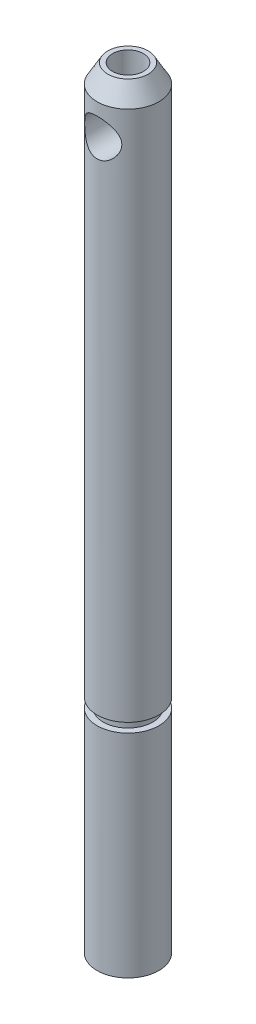
ISO-10303-21;
HEADER;
FILE_DESCRIPTION(('STEP AP214'),'2;1');
FILE_NAME('part.step','',(''),(''),'','','');
FILE_SCHEMA(('AUTOMOTIVE_DESIGN { 1 0 10303 214 1 1 1 1 }'));
ENDSEC;
DATA;
#1=APPLICATION_CONTEXT('core data for automotive mechanical design processes');
#2=APPLICATION_PROTOCOL_DEFINITION('international standard','automotive_design',2000,#1);
#3=PRODUCT_CONTEXT('',#1,'mechanical');
#4=PRODUCT('Part','Part','',(#3));
#5=PRODUCT_RELATED_PRODUCT_CATEGORY('part','',(#4));
#6=PRODUCT_DEFINITION_FORMATION('','',#4);
#7=PRODUCT_DEFINITION_CONTEXT('part definition',#1,'design');
#8=PRODUCT_DEFINITION('design','',#6,#7);
#9=PRODUCT_DEFINITION_SHAPE('','',#8);
#10=(LENGTH_UNIT() NAMED_UNIT(*) SI_UNIT(.MILLI.,.METRE.));
#11=(NAMED_UNIT(*) PLANE_ANGLE_UNIT() SI_UNIT($,.RADIAN.));
#12=(NAMED_UNIT(*) SI_UNIT($,.STERADIAN.) SOLID_ANGLE_UNIT());
#13=UNCERTAINTY_MEASURE_WITH_UNIT(LENGTH_MEASURE(1.E-05),#10,'distance_accuracy_value','');
#14=(GEOMETRIC_REPRESENTATION_CONTEXT(3) GLOBAL_UNCERTAINTY_ASSIGNED_CONTEXT((#13)) GLOBAL_UNIT_ASSIGNED_CONTEXT((#10,
#11,#12)) REPRESENTATION_CONTEXT('',''));
#15=CARTESIAN_POINT('',(0.,0.,0.));
#16=DIRECTION('',(0.,0.,1.));
#17=DIRECTION('',(1.,0.,0.));
#18=AXIS2_PLACEMENT_3D('',#15,#16,#17);
#19=CARTESIAN_POINT('',(0.,62.34264779,0.));
#20=DIRECTION('',(0.,-1.,0.));
#21=DIRECTION('',(0.,0.,-1.));
#22=AXIS2_PLACEMENT_3D('',#19,#20,#21);
#23=CYLINDRICAL_SURFACE('',#22,2.5);
#24=CARTESIAN_POINT('',(0.,17.9,0.));
#25=DIRECTION('',(0.,1.,0.));
#26=DIRECTION('',(0.,0.,1.));
#27=AXIS2_PLACEMENT_3D('',#24,#25,#26);
#28=CIRCLE('',#27,2.5);
#29=CARTESIAN_POINT('',(0.,17.9,2.5));
#30=VERTEX_POINT('',#29);
#31=EDGE_CURVE('E40',#30,#30,#28,.T.);
#32=ORIENTED_EDGE('',*,*,#31,.T.);
#33=EDGE_LOOP('',(#32));
#34=FACE_BOUND('',#33,.T.);
#35=CARTESIAN_POINT('',(0.,59.84264779,-2.49999999999995));
#36=CARTESIAN_POINT('',(-0.0767298334620718,59.8426436989901,-2.4999962578972));
#37=CARTESIAN_POINT('',(-0.153582320644234,59.8367191190737,-2.49642904615007));
#38=CARTESIAN_POINT('',(-0.304975509530731,59.8133234704847,-2.48249903608569));
#39=CARTESIAN_POINT('',(-0.379510034596095,59.7958239281458,-2.47211948032716));
#40=CARTESIAN_POINT('',(-0.523751827790879,59.7502614288332,-2.44561558054484));
#41=CARTESIAN_POINT('',(-0.593481028226607,59.7222508318368,-2.42951973272942));
#42=CARTESIAN_POINT('',(-0.727030318214689,59.656787456859,-2.39295367626407));
#43=CARTESIAN_POINT('',(-0.790851869416403,59.6193370230312,-2.37248455380253));
#44=CARTESIAN_POINT('',(-0.916299278999338,59.5328729632914,-2.32705360719085));
#45=CARTESIAN_POINT('',(-0.977384020081455,59.4831940946486,-2.30186792195982));
#46=CARTESIAN_POINT('',(-1.09088270411892,59.3751805861717,-2.25030439279634));
#47=CARTESIAN_POINT('',(-1.14328534948109,59.3168348528127,-2.22392505153574));
#48=CARTESIAN_POINT('',(-1.24444996762972,59.1847242795032,-2.16911066995912));
#49=CARTESIAN_POINT('',(-1.29197766378813,59.1099460190187,-2.14082017703647));
#50=CARTESIAN_POINT('',(-1.373614377649,58.9518012167569,-2.08938301412121));
#51=CARTESIAN_POINT('',(-1.40774517335157,58.8684488937524,-2.06622802273938));
#52=CARTESIAN_POINT('',(-1.45440601714221,58.7160513393467,-2.03354629660929));
#53=CARTESIAN_POINT('',(-1.47016197246832,58.6484117913897,-2.02207883137587));
#54=CARTESIAN_POINT('',(-1.4921617234048,58.5108440741697,-2.00590308295499));
#55=CARTESIAN_POINT('',(-1.49841734556833,58.4409188612455,-2.00118639643758));
#56=CARTESIAN_POINT('',(-1.50105508796006,58.3006362957827,-1.99920922463854));
#57=CARTESIAN_POINT('',(-1.49741783408424,58.2302783649068,-2.00196337012714));
#58=CARTESIAN_POINT('',(-1.48046060478834,58.0913690145724,-2.01453261443737));
#59=CARTESIAN_POINT('',(-1.46713334620101,58.0228189941526,-2.02435302432224));
#60=CARTESIAN_POINT('',(-1.43173921881789,57.8901175478719,-2.04953186944256));
#61=CARTESIAN_POINT('',(-1.4097874866609,57.8259207360755,-2.06481711652532));
#62=CARTESIAN_POINT('',(-1.35795061770843,57.7019527990719,-2.09927051350827));
#63=CARTESIAN_POINT('',(-1.32806257259708,57.6421833065761,-2.1184400862347));
#64=CARTESIAN_POINT('',(-1.25517983184584,57.5176636928772,-2.16255327268992));
#65=CARTESIAN_POINT('',(-1.21080724397728,57.4538696970451,-2.18792043372991));
#66=CARTESIAN_POINT('',(-1.11291092784011,57.333971306333,-2.23930599764375));
#67=CARTESIAN_POINT('',(-1.05937845100585,57.2778743560235,-2.26532500262147));
#68=CARTESIAN_POINT('',(-0.935811834383026,57.1670348081783,-2.31935504958316));
#69=CARTESIAN_POINT('',(-0.864517682705022,57.113570483984,-2.34713836268529));
#70=CARTESIAN_POINT('',(-0.712276050459062,57.0195257428021,-2.3977242843398));
#71=CARTESIAN_POINT('',(-0.631333763943617,56.9789384362101,-2.42052955425519));
#72=CARTESIAN_POINT('',(-0.467197585268256,56.9147156072041,-2.45730392066156));
#73=CARTESIAN_POINT('',(-0.384467624173638,56.8901724342841,-2.47173957439704));
#74=CARTESIAN_POINT('',(-0.215047895144708,56.8556365925946,-2.49218842813548));
#75=CARTESIAN_POINT('',(-0.128363005661391,56.8456264722464,-2.49821172952736));
#76=CARTESIAN_POINT('',(0.0337146143773301,56.8411399423217,-2.5009057037461));
#77=CARTESIAN_POINT('',(0.10904247341866,56.8447389349148,-2.49873521714286));
#78=CARTESIAN_POINT('',(0.257829401986011,56.8630736430719,-2.48778712087049));
#79=CARTESIAN_POINT('',(0.331288509376057,56.8778091328058,-2.47900964518037));
#80=CARTESIAN_POINT('',(0.472574932157575,56.9171912228125,-2.4559479244219));
#81=CARTESIAN_POINT('',(0.540495750928455,56.9415881390735,-2.44180275662556));
#82=CARTESIAN_POINT('',(0.671265749087239,56.9993251663653,-2.40913880862845));
#83=CARTESIAN_POINT('',(0.734113924963879,57.0326670413467,-2.39061916586509));
#84=CARTESIAN_POINT('',(0.860006262823825,57.1112047692087,-2.34845496237357));
#85=CARTESIAN_POINT('',(0.922394150456796,57.1572716190784,-2.32447802739878));
#86=CARTESIAN_POINT('',(1.03902603131012,57.2580391834886,-2.27474265574736));
#87=CARTESIAN_POINT('',(1.0932604027374,57.3127499448525,-2.24898216586369));
#88=CARTESIAN_POINT('',(1.1993199673558,57.4375581800371,-2.19445423909898));
#89=CARTESIAN_POINT('',(1.2499101963091,57.5087316754655,-2.16573241746293));
#90=CARTESIAN_POINT('',(1.33845238915663,57.6598638145682,-2.11216182066714));
#91=CARTESIAN_POINT('',(1.37641766769782,57.7398130838928,-2.08730897997701));
#92=CARTESIAN_POINT('',(1.43142578795776,57.8888908123067,-2.04984909240529));
#93=CARTESIAN_POINT('',(1.45121625336185,57.9566281023586,-2.03575659328733));
#94=CARTESIAN_POINT('',(1.48113663905967,58.0951798680801,-2.01409605743547));
#95=CARTESIAN_POINT('',(1.49127995297631,58.1659899343278,-2.00651897642729));
#96=CARTESIAN_POINT('',(1.50134130416631,58.309024737597,-1.99900446616276));
#97=CARTESIAN_POINT('',(1.50122089107863,58.381253780687,-1.99909576445939));
#98=CARTESIAN_POINT('',(1.49066472959323,58.5245422256094,-2.00697717892856));
#99=CARTESIAN_POINT('',(1.48022337215761,58.5956009700806,-2.01477148138835));
#100=CARTESIAN_POINT('',(1.45040174148914,58.7311362075722,-2.03633185242994));
#101=CARTESIAN_POINT('',(1.43147636845346,58.7957648843068,-2.04979211805585));
#102=CARTESIAN_POINT('',(1.38563242076988,58.9209850444742,-2.08105501960154));
#103=CARTESIAN_POINT('',(1.35871083588482,58.9815749969605,-2.09885929040494));
#104=CARTESIAN_POINT('',(1.29289245555737,59.1069676472207,-2.14012990550929));
#105=CARTESIAN_POINT('',(1.25279167675749,59.1709888938543,-2.16404587582642));
#106=CARTESIAN_POINT('',(1.16375698389078,59.2920278626173,-2.2132012703077));
#107=CARTESIAN_POINT('',(1.11481579607797,59.3490397521525,-2.23844177205034));
#108=CARTESIAN_POINT('',(1.00009777425735,59.4639987391317,-2.29225690291491));
#109=CARTESIAN_POINT('',(0.932876819313867,59.5205788648962,-2.32070308663662));
#110=CARTESIAN_POINT('',(0.788462434445526,59.6217456458633,-2.37365428872366));
#111=CARTESIAN_POINT('',(0.711265444501501,59.6663280019848,-2.39815789310939));
#112=CARTESIAN_POINT('',(0.551125230801421,59.7404335975737,-2.439855786544));
#113=CARTESIAN_POINT('',(0.468430086957164,59.7703758549268,-2.4572507747979));
#114=CARTESIAN_POINT('',(0.297973306118754,59.815372485211,-2.48366273001244));
#115=CARTESIAN_POINT('',(0.210232099648571,59.8304829578571,-2.49271125871481));
#116=CARTESIAN_POINT('',(0.101558096917495,59.8393452447087,-2.49802001168187));
#117=CARTESIAN_POINT('',(0.0812762590282334,59.8405822073061,-2.49876114656363));
#118=CARTESIAN_POINT('',(0.0406658206870625,59.8422340363708,-2.49975164517366));
#119=CARTESIAN_POINT('',(0.0203372186375168,59.8426488743209,-2.50000099184312));
#120=CARTESIAN_POINT('',(0.,59.84264779,-2.49999999999995));
#121=B_SPLINE_CURVE_WITH_KNOTS('',3,(#35,#36,#37,#38,#39,#40,#41,#42,#43,#44,#45,#46,#47,#48,
#49,#50,#51,#52,#53,#54,#55,#56,#57,#58,#59,#60,#61,#62,#63,#64,#65,#66,#67,#68,#69,#70,#71,#72,
#73,#74,#75,#76,#77,#78,#79,#80,#81,#82,#83,#84,#85,#86,#87,#88,#89,#90,#91,#92,#93,#94,#95,#96,
#97,#98,#99,#100,#101,#102,#103,#104,#105,#106,#107,#108,#109,#110,#111,#112,#113,#114,#115,
#116,#117,#118,#119,#120),.UNSPECIFIED.,.T.,.F.,(4,2,2,2,2,2,2,2,2,2,2,2,2,2,2,2,2,2,2,2,2,2,2,
2,2,2,2,2,2,2,2,2,2,2,2,2,2,2,2,2,2,2,4),(0.,0.230102237548649,0.460772627519992,
0.690308884599988,0.919788197992263,1.16681590732468,1.41416257934793,1.69183813189803,
1.96906040692089,2.17933829855629,2.38935420916571,2.59978170870722,2.81036753273871,
3.01823267593204,3.22617409809864,3.47046995225156,3.71500044803666,3.99360957884686,
4.27206939275321,4.53296790696554,4.79355286918229,5.01875602722421,5.24395461863452,
5.46367785689769,5.68344445659025,5.92601365818359,6.16886690081832,6.44336762428005,
6.71757792616453,6.93257787314689,7.14727888733313,7.36278425777428,7.57840681155721,
7.78364098331137,7.98895251523027,8.2257861005228,8.46281544370204,8.73854311775514,
9.0143694603198,9.28175654462673,9.54812832184443,9.60911473335173,9.67010326027637),.UNSPECIFIED.);
#122=CARTESIAN_POINT('',(0.,59.84264779,-2.49999999999995));
#123=VERTEX_POINT('',#122);
#124=EDGE_CURVE('E87',#123,#123,#121,.T.);
#125=ORIENTED_EDGE('',*,*,#124,.T.);
#126=EDGE_LOOP('',(#125));
#127=FACE_BOUND('',#126,.T.);
#128=CARTESIAN_POINT('',(1.5,58.34264779,1.99999999999989));
#129=CARTESIAN_POINT('',(1.50000404108592,58.2671688147104,1.99999416642501));
#130=CARTESIAN_POINT('',(1.49426852824009,58.1917093559202,2.00433633903484));
#131=CARTESIAN_POINT('',(1.47174965152782,58.0433238860378,2.02092590613887));
#132=CARTESIAN_POINT('',(1.45495475788934,57.9704006026149,2.03318155043089));
#133=CARTESIAN_POINT('',(1.41143486335795,57.8295641483227,2.0636233903472));
#134=CARTESIAN_POINT('',(1.38478154503148,57.7616189519648,2.08176666183121));
#135=CARTESIAN_POINT('',(1.32252909283017,57.6312103366321,2.12185904995836));
#136=CARTESIAN_POINT('',(1.28692729054693,57.5687485603049,2.14380930122403));
#137=CARTESIAN_POINT('',(1.20271292747645,57.4426987733359,2.19228594587526));
#138=CARTESIAN_POINT('',(1.15304179435289,57.3799068328761,2.21904371037658));
#139=CARTESIAN_POINT('',(1.04426801309984,57.2628830272583,2.27226229431065));
#140=CARTESIAN_POINT('',(0.985158296729603,57.2086576383292,2.29872287517103));
#141=CARTESIAN_POINT('',(0.851442367411683,57.1045139802903,2.35175567858731));
#142=CARTESIAN_POINT('',(0.775851995162525,57.0556933263302,2.37803133577816));
#143=CARTESIAN_POINT('',(0.615654228271644,56.9718380675556,2.42443786983181));
#144=CARTESIAN_POINT('',(0.531055196626329,56.9367908158773,2.4445743798874));
#145=CARTESIAN_POINT('',(0.363771406742672,56.8850518671873,2.47470987800445));
#146=CARTESIAN_POINT('',(0.281674698130917,56.8669274290327,2.48549303939172));
#147=CARTESIAN_POINT('',(0.114970509382712,56.8447049871369,2.49874939277543));
#148=CARTESIAN_POINT('',(0.0303654624001621,56.8405938119999,2.50123038813302));
#149=CARTESIAN_POINT('',(-0.12763728373731,56.8462615373424,2.49783372711534));
#150=CARTESIAN_POINT('',(-0.201123832865647,56.8543813161693,2.49295437513726));
#151=CARTESIAN_POINT('',(-0.34546426915179,56.8811275856481,2.47707997553857));
#152=CARTESIAN_POINT('',(-0.416317961051221,56.8997548539071,2.46608447529305));
#153=CARTESIAN_POINT('',(-0.554056780469102,56.9468133527038,2.43884907201714));
#154=CARTESIAN_POINT('',(-0.620916491037646,56.975300851139,2.42257910450821));
#155=CARTESIAN_POINT('',(-0.74898866011563,57.0410324062255,2.38609637638749));
#156=CARTESIAN_POINT('',(-0.810199646208015,57.078278737059,2.36588259201815));
#157=CARTESIAN_POINT('',(-0.933074267143204,57.1654868828044,2.32037925976365));
#158=CARTESIAN_POINT('',(-0.993918663198215,57.2164361017357,2.29477182952149));
#159=CARTESIAN_POINT('',(-1.10671465909276,57.3270519078601,2.24255554245601));
#160=CARTESIAN_POINT('',(-1.15865401308338,57.3867302934745,2.2159453670338));
#161=CARTESIAN_POINT('',(-1.25824837767417,57.5213011961636,2.1611107512395));
#162=CARTESIAN_POINT('',(-1.30470933188636,57.5971553665394,2.13305661385123));
#163=CARTESIAN_POINT('',(-1.38397217194237,57.7573540216366,2.08250879557262));
#164=CARTESIAN_POINT('',(-1.4167992196219,57.8416825061256,2.06000490298816));
#165=CARTESIAN_POINT('',(-1.46077497064845,57.9950414218953,2.02895865196728));
#166=CARTESIAN_POINT('',(-1.47527903312671,58.0626884222966,2.01833888618312));
#167=CARTESIAN_POINT('',(-1.49480872755289,58.2000214002994,2.00392150777554));
#168=CARTESIAN_POINT('',(-1.49984538302909,58.2697049104845,2.00011596115111));
#169=CARTESIAN_POINT('',(-1.50014781114185,58.4091994724357,1.99988914321318));
#170=CARTESIAN_POINT('',(-1.49540004697665,58.4790105672152,2.00347810223979));
#171=CARTESIAN_POINT('',(-1.47640290574946,58.6166351337486,2.0175152078865));
#172=CARTESIAN_POINT('',(-1.46214601830139,58.6844469822403,2.02796877613214));
#173=CARTESIAN_POINT('',(-1.42488312618655,58.8163623694798,2.05431768333101));
#174=CARTESIAN_POINT('',(-1.40188805257365,58.8804704265323,2.0702062209281));
#175=CARTESIAN_POINT('',(-1.34796261057077,59.0041255057302,2.10571539417584));
#176=CARTESIAN_POINT('',(-1.31702924888215,59.063670796366,2.12533743689999));
#177=CARTESIAN_POINT('',(-1.24167439558514,59.1878878725122,2.17036819177738));
#178=CARTESIAN_POINT('',(-1.19582663060306,59.2515486250966,2.19618239397368));
#179=CARTESIAN_POINT('',(-1.09487395518703,59.3709332748495,2.24821754803619));
#180=CARTESIAN_POINT('',(-1.03976018672402,59.4266494821691,2.27443886711456));
#181=CARTESIAN_POINT('',(-0.913274837212744,59.5358717973504,2.32835625910916));
#182=CARTESIAN_POINT('',(-0.840721108780185,59.5881485166058,2.35580075875872));
#183=CARTESIAN_POINT('',(-0.686103100868024,59.6795505668367,2.40537639133457));
#184=CARTESIAN_POINT('',(-0.604045176134701,59.7186846178409,2.42751104449407));
#185=CARTESIAN_POINT('',(-0.438840232972131,59.7795159934314,2.46252280092772));
#186=CARTESIAN_POINT('',(-0.356205963651248,59.8022740177911,2.47595588067328));
#187=CARTESIAN_POINT('',(-0.187383063890838,59.8333623928462,2.49440738906101));
#188=CARTESIAN_POINT('',(-0.101198571781943,59.8417090807176,2.49943534582738));
#189=CARTESIAN_POINT('',(0.059812023201008,59.8433223985859,2.50040600461976));
#190=CARTESIAN_POINT('',(0.134620583589722,59.838451124563,2.49747057186327));
#191=CARTESIAN_POINT('',(0.28214875597878,59.8177539656184,2.48512948412095));
#192=CARTESIAN_POINT('',(0.354868344701919,59.8019279586784,2.4757237570664));
#193=CARTESIAN_POINT('',(0.495145481978795,59.7604282184162,2.45149427526962));
#194=CARTESIAN_POINT('',(0.562767032608823,59.7349161938707,2.43675966858906));
#195=CARTESIAN_POINT('',(0.692781971999994,59.6750071954452,2.40303337447155));
#196=CARTESIAN_POINT('',(0.755174184199864,59.6406082291404,2.3840407325227));
#197=CARTESIAN_POINT('',(0.880263645295977,59.5597225934312,2.34093432659384));
#198=CARTESIAN_POINT('',(0.942258690439939,59.5123290809831,2.31648844639152));
#199=CARTESIAN_POINT('',(1.05789751536306,59.4088947562822,2.26601907350658));
#200=CARTESIAN_POINT('',(1.11153190956918,59.3528443643921,2.23999385274502));
#201=CARTESIAN_POINT('',(1.21590975350571,59.2253622278223,2.185281656662));
#202=CARTESIAN_POINT('',(1.26542406663364,59.1528813038344,2.15667566270904));
#203=CARTESIAN_POINT('',(1.35156817210323,58.9991629372334,2.10376464485146));
#204=CARTESIAN_POINT('',(1.38820466322664,58.9179300760186,2.07945738811043));
#205=CARTESIAN_POINT('',(1.44437116535134,58.7555835048628,2.04080003047955));
#206=CARTESIAN_POINT('',(1.46509526060183,58.6750525540387,2.02577665830143));
#207=CARTESIAN_POINT('',(1.49289268240421,58.5105503952963,2.00539032320038));
#208=CARTESIAN_POINT('',(1.49999550595837,58.4265870242413,2.00000648744631));
#209=CARTESIAN_POINT('',(1.5,58.34264779,1.99999999999989));
#210=B_SPLINE_CURVE_WITH_KNOTS('',3,(#128,#129,#130,#131,#132,#133,#134,#135,#136,#137,#138,
#139,#140,#141,#142,#143,#144,#145,#146,#147,#148,#149,#150,#151,#152,#153,#154,#155,#156,#157,
#158,#159,#160,#161,#162,#163,#164,#165,#166,#167,#168,#169,#170,#171,#172,#173,#174,#175,#176,
#177,#178,#179,#180,#181,#182,#183,#184,#185,#186,#187,#188,#189,#190,#191,#192,#193,#194,#195,
#196,#197,#198,#199,#200,#201,#202,#203,#204,#205,#206,#207,#208,#209),.UNSPECIFIED.,.T.,.F.,(4,
2,2,2,2,2,2,2,2,2,2,2,2,2,2,2,2,2,2,2,2,2,2,2,2,2,2,2,2,2,2,2,2,2,2,2,2,2,2,2,4),(0.,
0.226085249493367,0.452406574330726,0.677113624991826,0.901887762215862,1.15414462389996,
1.40659128601842,1.68630157736222,1.96575443271219,2.21853330858495,2.47107452602764,
2.69230130543181,2.91354445887946,3.13607155036376,3.35865648368875,3.60782810055846,
3.85733966656906,4.13576671140276,4.41367760154768,4.62276298054685,4.83160475643978,
5.04073566011186,5.25003193304136,5.459067243655,5.66818149154664,5.91499438482007,
6.16204457978462,6.44121828011596,6.72020638384853,6.97891479383345,7.23732973022735,
7.46129321849406,7.68525920139654,7.90563970188763,8.12606965394592,8.37042963549495,
8.61506198741964,8.89071695766611,9.16622832484813,9.41820120134361,9.66962780912282),.UNSPECIFIED.);
#211=CARTESIAN_POINT('',(1.5,58.34264779,1.99999999999989));
#212=VERTEX_POINT('',#211);
#213=EDGE_CURVE('E80',#212,#212,#210,.T.);
#214=ORIENTED_EDGE('',*,*,#213,.T.);
#215=EDGE_LOOP('',(#214));
#216=FACE_BOUND('',#215,.T.);
#217=CARTESIAN_POINT('',(0.,60.84264779,0.));
#218=DIRECTION('',(0.,1.,0.));
#219=DIRECTION('',(0.,0.,1.));
#220=AXIS2_PLACEMENT_3D('',#217,#218,#219);
#221=CIRCLE('',#220,2.5);
#222=CARTESIAN_POINT('',(0.,60.84264779,2.5));
#223=VERTEX_POINT('',#222);
#224=EDGE_CURVE('E114',#223,#223,#221,.F.);
#225=ORIENTED_EDGE('',*,*,#224,.T.);
#226=EDGE_LOOP('',(#225));
#227=FACE_BOUND('',#226,.T.);
#228=ADVANCED_FACE('F36',(#34,#127,#216,#227),#23,.T.);
#229=CARTESIAN_POINT('',(0.,62.34264779,0.));
#230=DIRECTION('',(0.,1.,0.));
#231=DIRECTION('',(0.,0.,1.));
#232=AXIS2_PLACEMENT_3D('',#229,#230,#231);
#233=PLANE('',#232);
#234=CARTESIAN_POINT('',(0.,62.34264779,0.));
#235=DIRECTION('',(0.,1.,0.));
#236=DIRECTION('',(0.,0.,1.));
#237=AXIS2_PLACEMENT_3D('',#234,#235,#236);
#238=CIRCLE('',#237,1.24999999999999);
#239=CARTESIAN_POINT('',(0.,62.34264779,1.24999999999999));
#240=VERTEX_POINT('',#239);
#241=EDGE_CURVE('E165',#240,#240,#238,.T.);
#242=ORIENTED_EDGE('',*,*,#241,.F.);
#243=EDGE_LOOP('',(#242));
#244=FACE_BOUND('',#243,.T.);
#245=CARTESIAN_POINT('',(0.,62.34264779,0.));
#246=DIRECTION('',(0.,1.,0.));
#247=DIRECTION('',(0.,0.,1.));
#248=AXIS2_PLACEMENT_3D('',#245,#246,#247);
#249=CIRCLE('',#248,1.63397459621555);
#250=CARTESIAN_POINT('',(0.,62.34264779,1.63397459621555));
#251=VERTEX_POINT('',#250);
#252=EDGE_CURVE('E164',#251,#251,#249,.T.);
#253=ORIENTED_EDGE('',*,*,#252,.T.);
#254=EDGE_LOOP('',(#253));
#255=FACE_BOUND('',#254,.T.);
#256=ADVANCED_FACE('F144',(#244,#255),#233,.T.);
#257=CARTESIAN_POINT('',(0.,62.34264779,0.));
#258=DIRECTION('',(0.,-1.,0.));
#259=DIRECTION('',(0.,0.,-1.));
#260=AXIS2_PLACEMENT_3D('',#257,#258,#259);
#261=CONICAL_SURFACE('',#260,1.63397459621555,0.523598775598299);
#262=ORIENTED_EDGE('',*,*,#224,.F.);
#263=EDGE_LOOP('',(#262));
#264=FACE_BOUND('',#263,.T.);
#265=ORIENTED_EDGE('',*,*,#252,.F.);
#266=EDGE_LOOP('',(#265));
#267=FACE_BOUND('',#266,.T.);
#268=ADVANCED_FACE('F38',(#264,#267),#261,.T.);
#269=CARTESIAN_POINT('',(0.,62.34264779,0.));
#270=DIRECTION('',(0.,1.,0.));
#271=DIRECTION('',(0.,0.,1.));
#272=AXIS2_PLACEMENT_3D('',#269,#270,#271);
#273=CYLINDRICAL_SURFACE('',#272,1.24999999999999);
#274=CARTESIAN_POINT('',(0.,59.84264779,1.24999999999997));
#275=CARTESIAN_POINT('',(-0.0593787688504985,59.8426453960051,1.24999755162011));
#276=CARTESIAN_POINT('',(-0.118775657075969,59.8390911230602,1.24573873608632));
#277=CARTESIAN_POINT('',(-0.235591229710267,59.8252016242696,1.22901865029432));
#278=CARTESIAN_POINT('',(-0.293008415894371,59.8148613764697,1.21655130529971));
#279=CARTESIAN_POINT('',(-0.403915034737324,59.7883611698592,1.18434389929647));
#280=CARTESIAN_POINT('',(-0.457425697494271,59.7722360079471,1.16464730700095));
#281=CARTESIAN_POINT('',(-0.55992045809507,59.7352939358073,1.11899163190359));
#282=CARTESIAN_POINT('',(-0.608903018804495,59.7144754405418,1.09303043320274));
#283=CARTESIAN_POINT('',(-0.718951202770193,59.6610173962405,1.02527232994856));
#284=CARTESIAN_POINT('',(-0.777846384687506,59.6268446330918,0.981161424597103));
#285=CARTESIAN_POINT('',(-0.886006690341679,59.5547668337134,0.884741320224263));
#286=CARTESIAN_POINT('',(-0.935244207719133,59.5168515508956,0.832409367774606));
#287=CARTESIAN_POINT('',(-1.02476981505217,59.4396432682186,0.719475666551739));
#288=CARTESIAN_POINT('',(-1.06487540714462,59.4003377572931,0.658738788995361));
#289=CARTESIAN_POINT('',(-1.1346094697534,59.3251211682379,0.529649327753191));
#290=CARTESIAN_POINT('',(-1.16426870455505,59.2892003550435,0.461319899248873));
#291=CARTESIAN_POINT('',(-1.20096809386345,59.2416144929298,0.349152321823404));
#292=CARTESIAN_POINT('',(-1.2121691769959,59.2263312437797,0.308234151359267));
#293=CARTESIAN_POINT('',(-1.23050643018312,59.2006117998923,0.224058908581036));
#294=CARTESIAN_POINT('',(-1.23765246650146,59.1901638520024,0.180807796016878));
#295=CARTESIAN_POINT('',(-1.24740539483338,59.1757529297613,0.0921161932337518));
#296=CARTESIAN_POINT('',(-1.24995600781897,59.1718703953019,0.0466554691684949));
#297=CARTESIAN_POINT('',(-1.25004286433054,59.1717392801722,-0.0442807551980288));
#298=CARTESIAN_POINT('',(-1.2475790421298,59.1754907995654,-0.0897562556851659));
#299=CARTESIAN_POINT('',(-1.23752620102328,59.1903556786057,-0.182763549838968));
#300=CARTESIAN_POINT('',(-1.2295274513961,59.202056102457,-0.230151202597575));
#301=CARTESIAN_POINT('',(-1.20871318849993,59.2310903231659,-0.322101145839457));
#302=CARTESIAN_POINT('',(-1.19588169148343,59.248442787456,-0.366653480876628));
#303=CARTESIAN_POINT('',(-1.1572256313013,59.2977869247082,-0.478104397695245));
#304=CARTESIAN_POINT('',(-1.12819923859672,59.3323823317423,-0.54271488020592));
#305=CARTESIAN_POINT('',(-1.0607172410451,59.4044114169616,-0.665028739011595));
#306=CARTESIAN_POINT('',(-1.02224478491081,59.4418500840155,-0.722719494040667));
#307=CARTESIAN_POINT('',(-0.933838554257844,59.5180327498887,-0.834120412783245));
#308=CARTESIAN_POINT('',(-0.88341140823604,59.556742899928,-0.88746569638826));
#309=CARTESIAN_POINT('',(-0.772419565040686,59.6301969049583,-0.985559630438914));
#310=CARTESIAN_POINT('',(-0.711877274428563,59.6649492470877,-1.03032682216843));
#311=CARTESIAN_POINT('',(-0.59705631416896,59.7197916838296,-1.09970681083113));
#312=CARTESIAN_POINT('',(-0.544863772530671,59.7413893589319,-1.12657128594303));
#313=CARTESIAN_POINT('',(-0.435535617240913,59.7791869914236,-1.1731715356764));
#314=CARTESIAN_POINT('',(-0.378403116632056,59.7953903174189,-1.19291175982449));
#315=CARTESIAN_POINT('',(-0.25997718059178,59.8211969118404,-1.22420858059791));
#316=CARTESIAN_POINT('',(-0.198655468325038,59.8307491801647,-1.23570196071463));
#317=CARTESIAN_POINT('',(-0.0742799817039895,59.8421049772496,-1.24935462856928));
#318=CARTESIAN_POINT('',(-0.0112273946835205,59.8439136904991,-1.25152016152218));
#319=CARTESIAN_POINT('',(0.106655102299903,59.839872777293,-1.2466687749113));
#320=CARTESIAN_POINT('',(0.161565285324156,59.8349145251792,-1.24072067022759));
#321=CARTESIAN_POINT('',(0.269322467292329,59.8192757557052,-1.22186653531031));
#322=CARTESIAN_POINT('',(0.32216921793146,59.808594551932,-1.20895967043917));
#323=CARTESIAN_POINT('',(0.425282807428065,59.7820953311319,-1.17668826548714));
#324=CARTESIAN_POINT('',(0.475505558665468,59.7662103651791,-1.15723946784766));
#325=CARTESIAN_POINT('',(0.571829286856169,59.7303286630424,-1.11280232131271));
#326=CARTESIAN_POINT('',(0.617928731328829,59.7103304071373,-1.08781192471693));
#327=CARTESIAN_POINT('',(0.725338376691851,59.6575222014701,-1.02078335853516));
#328=CARTESIAN_POINT('',(0.784177111169715,59.6229929252154,-0.976130353623697));
#329=CARTESIAN_POINT('',(0.892139643516429,59.5502661221268,-0.87858317397239));
#330=CARTESIAN_POINT('',(0.941232285418773,59.5120573931547,-0.825663506224553));
#331=CARTESIAN_POINT('',(1.03033901299864,59.4344121031511,-0.711512047530487));
#332=CARTESIAN_POINT('',(1.0701737533009,59.394965821116,-0.650147769366061));
#333=CARTESIAN_POINT('',(1.13922410535006,59.3197536503252,-0.51970741985203));
#334=CARTESIAN_POINT('',(1.16847444328378,59.283976007252,-0.450657557281269));
#335=CARTESIAN_POINT('',(1.20418713962592,59.237282978877,-0.337851015294669));
#336=CARTESIAN_POINT('',(1.21494166451883,59.2225033250452,-0.297079061568846));
#337=CARTESIAN_POINT('',(1.23241118575504,59.1978611382935,-0.213277726588215));
#338=CARTESIAN_POINT('',(1.23913627036995,59.1879863360877,-0.170254278728965));
#339=CARTESIAN_POINT('',(1.24808646608228,59.1747248857972,-0.0821801196691271));
#340=CARTESIAN_POINT('',(1.25025897513147,59.1714141039903,-0.0371117930516594));
#341=CARTESIAN_POINT('',(1.24969100631608,59.1722692743893,0.0529260641758407));
#342=CARTESIAN_POINT('',(1.24694923297193,59.1764371980961,0.097895565605059));
#343=CARTESIAN_POINT('',(1.23632620681833,59.1921119726516,0.190837495965893));
#344=CARTESIAN_POINT('',(1.22792861456552,59.2043532628057,0.238619561874902));
#345=CARTESIAN_POINT('',(1.20625214805457,59.2344428170983,0.331261206708337));
#346=CARTESIAN_POINT('',(1.19295712996401,59.2523095964306,0.376110535798329));
#347=CARTESIAN_POINT('',(1.15299054037417,59.3029411710796,0.488341798149878));
#348=CARTESIAN_POINT('',(1.12305667484074,59.3382713602982,0.553381329033061));
#349=CARTESIAN_POINT('',(1.05354944095067,59.4115788715156,0.676409635896378));
#350=CARTESIAN_POINT('',(1.0139591175589,59.4495607647866,0.73438573828648));
#351=CARTESIAN_POINT('',(0.923157683511308,59.5264960452725,0.845990753379527));
#352=CARTESIAN_POINT('',(0.871472234833876,59.5654058497595,0.899267484501726));
#353=CARTESIAN_POINT('',(0.757765343279721,59.638934185746,0.996935304625626));
#354=CARTESIAN_POINT('',(0.695767358080688,59.6735621522714,1.04134606754816));
#355=CARTESIAN_POINT('',(0.57927800588103,59.7273586522703,1.1091565169069));
#356=CARTESIAN_POINT('',(0.526999500141224,59.7482084825278,1.13501910031226));
#357=CARTESIAN_POINT('',(0.417719782772085,59.7844552706012,1.17960948970958));
#358=CARTESIAN_POINT('',(0.360724986716838,59.7998594903665,1.19834680009585));
#359=CARTESIAN_POINT('',(0.253310041564174,59.8219414832244,1.22509419634341));
#360=CARTESIAN_POINT('',(0.203422739425014,59.8296584911981,1.23438755201362));
#361=CARTESIAN_POINT('',(0.102361357783517,59.8400124147633,1.24684119321786));
#362=CARTESIAN_POINT('',(0.0511874114043489,59.842649853741,1.25000211062351));
#363=CARTESIAN_POINT('',(0.,59.84264779,1.24999999999997));
#364=B_SPLINE_CURVE_WITH_KNOTS('',3,(#274,#275,#276,#277,#278,#279,#280,#281,#282,#283,#284,
#285,#286,#287,#288,#289,#290,#291,#292,#293,#294,#295,#296,#297,#298,#299,#300,#301,#302,#303,
#304,#305,#306,#307,#308,#309,#310,#311,#312,#313,#314,#315,#316,#317,#318,#319,#320,#321,#322,
#323,#324,#325,#326,#327,#328,#329,#330,#331,#332,#333,#334,#335,#336,#337,#338,#339,#340,#341,
#342,#343,#344,#345,#346,#347,#348,#349,#350,#351,#352,#353,#354,#355,#356,#357,#358,#359,#360,
#361,#362,#363),.UNSPECIFIED.,.T.,.F.,(4,2,2,2,2,2,2,2,2,2,2,2,2,2,2,2,2,2,2,2,2,2,2,2,2,2,2,2,
2,2,2,2,2,2,2,2,2,2,2,2,2,2,2,2,4),(0.,0.17792063840756,0.355973095513483,0.532972026797759,
0.710030824150593,0.952125893800648,1.19490321558389,1.4421737640865,1.68870989486937,
1.82361318167479,1.95818681458037,2.09439761612089,2.23061020305625,2.37816635242831,
2.52621487430056,2.76143398970629,2.99707581215802,3.24501566810452,3.49241341014753,
3.67933989515105,3.86614943036553,4.05437609196176,4.24247671173497,4.4080464187528,
4.57363598871253,4.74144560410119,4.90931733118532,5.15261089108592,5.39667010414644,
5.64512295341114,5.89275310452965,6.02641745468291,6.15974574356449,6.29460624678863,
6.42950230652128,6.57876724728632,6.72852869227179,6.96677041328339,7.20543349464885,
7.45579032127,7.70558526561253,7.89070171070697,8.07557035570187,8.22896247938918,
8.38233879708317),.UNSPECIFIED.);
#365=CARTESIAN_POINT('',(0.,59.84264779,1.24999999999997));
#366=VERTEX_POINT('',#365);
#367=EDGE_CURVE('E76',#366,#366,#364,.T.);
#368=ORIENTED_EDGE('',*,*,#367,.T.);
#369=EDGE_LOOP('',(#368));
#370=FACE_BOUND('',#369,.T.);
#371=ORIENTED_EDGE('',*,*,#241,.T.);
#372=EDGE_LOOP('',(#371));
#373=FACE_BOUND('',#372,.T.);
#374=ADVANCED_FACE('F100',(#370,#373),#273,.F.);
#375=CARTESIAN_POINT('',(0.,58.34264779,-2.49999999999995));
#376=DIRECTION('',(0.,0.,1.));
#377=DIRECTION('',(1.,0.,0.));
#378=AXIS2_PLACEMENT_3D('',#375,#376,#377);
#379=CYLINDRICAL_SURFACE('',#378,1.5);
#380=ORIENTED_EDGE('',*,*,#367,.F.);
#381=EDGE_LOOP('',(#380));
#382=FACE_BOUND('',#381,.T.);
#383=ORIENTED_EDGE('',*,*,#213,.F.);
#384=EDGE_LOOP('',(#383));
#385=FACE_BOUND('',#384,.T.);
#386=ORIENTED_EDGE('',*,*,#124,.F.);
#387=EDGE_LOOP('',(#386));
#388=FACE_BOUND('',#387,.T.);
#389=ADVANCED_FACE('F94',(#382,#385,#388),#379,.F.);
#390=CARTESIAN_POINT('',(0.,17.9,0.));
#391=DIRECTION('',(0.,1.,0.));
#392=DIRECTION('',(0.,0.,1.));
#393=AXIS2_PLACEMENT_3D('',#390,#391,#392);
#394=PLANE('',#393);
#395=CARTESIAN_POINT('',(0.,17.9,0.));
#396=DIRECTION('',(0.,1.,0.));
#397=DIRECTION('',(0.,0.,1.));
#398=AXIS2_PLACEMENT_3D('',#395,#396,#397);
#399=CIRCLE('',#398,2.);
#400=CARTESIAN_POINT('',(0.,17.9,2.));
#401=VERTEX_POINT('',#400);
#402=EDGE_CURVE('E118',#401,#401,#399,.T.);
#403=ORIENTED_EDGE('',*,*,#402,.T.);
#404=EDGE_LOOP('',(#403));
#405=FACE_BOUND('',#404,.T.);
#406=ORIENTED_EDGE('',*,*,#31,.F.);
#407=EDGE_LOOP('',(#406));
#408=FACE_BOUND('',#407,.T.);
#409=ADVANCED_FACE('F99',(#405,#408),#394,.F.);
#410=CARTESIAN_POINT('',(0.,17.15,0.));
#411=DIRECTION('',(0.,1.,0.));
#412=DIRECTION('',(0.,0.,1.));
#413=AXIS2_PLACEMENT_3D('',#410,#411,#412);
#414=PLANE('',#413);
#415=CARTESIAN_POINT('',(0.,17.15,0.));
#416=DIRECTION('',(0.,1.,0.));
#417=DIRECTION('',(0.,0.,1.));
#418=AXIS2_PLACEMENT_3D('',#415,#416,#417);
#419=CIRCLE('',#418,2.);
#420=CARTESIAN_POINT('',(0.,17.15,2.));
#421=VERTEX_POINT('',#420);
#422=EDGE_CURVE('E123',#421,#421,#419,.T.);
#423=ORIENTED_EDGE('',*,*,#422,.F.);
#424=EDGE_LOOP('',(#423));
#425=FACE_BOUND('',#424,.T.);
#426=CARTESIAN_POINT('',(0.,17.15,0.));
#427=DIRECTION('',(0.,1.,0.));
#428=DIRECTION('',(0.,0.,1.));
#429=AXIS2_PLACEMENT_3D('',#426,#427,#428);
#430=CIRCLE('',#429,2.5);
#431=CARTESIAN_POINT('',(0.,17.15,2.5));
#432=VERTEX_POINT('',#431);
#433=EDGE_CURVE('E116',#432,#432,#430,.T.);
#434=ORIENTED_EDGE('',*,*,#433,.T.);
#435=EDGE_LOOP('',(#434));
#436=FACE_BOUND('',#435,.T.);
#437=ADVANCED_FACE('F132',(#425,#436),#414,.T.);
#438=CARTESIAN_POINT('',(0.,17.9,0.));
#439=DIRECTION('',(0.,-1.,0.));
#440=DIRECTION('',(0.,0.,-1.));
#441=AXIS2_PLACEMENT_3D('',#438,#439,#440);
#442=CYLINDRICAL_SURFACE('',#441,2.);
#443=ORIENTED_EDGE('',*,*,#402,.F.);
#444=EDGE_LOOP('',(#443));
#445=FACE_BOUND('',#444,.T.);
#446=ORIENTED_EDGE('',*,*,#422,.T.);
#447=EDGE_LOOP('',(#446));
#448=FACE_BOUND('',#447,.T.);
#449=ADVANCED_FACE('F130',(#445,#448),#442,.T.);
#450=CARTESIAN_POINT('',(0.,0.,0.));
#451=DIRECTION('',(0.,1.,0.));
#452=DIRECTION('',(0.,0.,1.));
#453=AXIS2_PLACEMENT_3D('',#450,#451,#452);
#454=PLANE('',#453);
#455=CARTESIAN_POINT('',(0.,0.,0.));
#456=DIRECTION('',(0.,1.,0.));
#457=DIRECTION('',(0.,0.,1.));
#458=AXIS2_PLACEMENT_3D('',#455,#456,#457);
#459=CIRCLE('',#458,2.5);
#460=CARTESIAN_POINT('',(-1.5,0.,2.));
#461=VERTEX_POINT('',#460);
#462=CARTESIAN_POINT('',(-1.5,0.,-2.));
#463=VERTEX_POINT('',#462);
#464=EDGE_CURVE('E74',#461,#463,#459,.T.);
#465=ORIENTED_EDGE('',*,*,#464,.F.);
#466=DIRECTION('',(0.,0.,-1.));
#467=VECTOR('',#466,1.);
#468=CARTESIAN_POINT('',(-1.5,0.,0.));
#469=LINE('',#468,#467);
#470=EDGE_CURVE('E45',#461,#463,#469,.T.);
#471=ORIENTED_EDGE('',*,*,#470,.T.);
#472=EDGE_LOOP('',(#465,#471));
#473=FACE_BOUND('',#472,.T.);
#474=ADVANCED_FACE('F139',(#473),#454,.F.);
#475=CARTESIAN_POINT('',(-1.50000000000006,0.,-2.50000000000006));
#476=DIRECTION('',(1.,0.,0.));
#477=DIRECTION('',(0.,0.,-1.));
#478=AXIS2_PLACEMENT_3D('',#475,#476,#477);
#479=PLANE('',#478);
#480=DIRECTION('',(0.,0.,1.));
#481=VECTOR('',#480,1.);
#482=CARTESIAN_POINT('',(-1.50000000000006,6.00000000000001,-2.50000000000006));
#483=LINE('',#482,#481);
#484=CARTESIAN_POINT('',(-1.5,6.00000000000001,-2.));
#485=VERTEX_POINT('',#484);
#486=CARTESIAN_POINT('',(-1.5,6.00000000000001,2.));
#487=VERTEX_POINT('',#486);
#488=EDGE_CURVE('E65',#485,#487,#483,.T.);
#489=ORIENTED_EDGE('',*,*,#488,.F.);
#490=DIRECTION('',(0.,-1.,0.));
#491=VECTOR('',#490,1.);
#492=CARTESIAN_POINT('',(-1.5,62.34264779,-2.));
#493=LINE('',#492,#491);
#494=EDGE_CURVE('E53',#463,#485,#493,.F.);
#495=ORIENTED_EDGE('',*,*,#494,.F.);
#496=ORIENTED_EDGE('',*,*,#470,.F.);
#497=DIRECTION('',(0.,-1.,0.));
#498=VECTOR('',#497,1.);
#499=CARTESIAN_POINT('',(-1.5,62.34264779,2.));
#500=LINE('',#499,#498);
#501=EDGE_CURVE('E68',#487,#461,#500,.T.);
#502=ORIENTED_EDGE('',*,*,#501,.F.);
#503=EDGE_LOOP('',(#489,#495,#496,#502));
#504=FACE_BOUND('',#503,.T.);
#505=ADVANCED_FACE('F67',(#504),#479,.F.);
#506=CARTESIAN_POINT('',(-2.50000000000006,6.00000000000001,-2.50000000000006));
#507=DIRECTION('',(0.,1.,0.));
#508=DIRECTION('',(0.,0.,1.));
#509=AXIS2_PLACEMENT_3D('',#506,#507,#508);
#510=PLANE('',#509);
#511=ORIENTED_EDGE('',*,*,#488,.T.);
#512=CARTESIAN_POINT('',(0.,6.00000000000001,0.));
#513=DIRECTION('',(0.,1.,0.));
#514=DIRECTION('',(0.,0.,1.));
#515=AXIS2_PLACEMENT_3D('',#512,#513,#514);
#516=CIRCLE('',#515,2.5);
#517=EDGE_CURVE('E11',#485,#487,#516,.T.);
#518=ORIENTED_EDGE('',*,*,#517,.F.);
#519=EDGE_LOOP('',(#511,#518));
#520=FACE_BOUND('',#519,.T.);
#521=ADVANCED_FACE('F64',(#520),#510,.F.);
#522=ORIENTED_EDGE('',*,*,#517,.T.);
#523=ORIENTED_EDGE('',*,*,#501,.T.);
#524=ORIENTED_EDGE('',*,*,#464,.T.);
#525=ORIENTED_EDGE('',*,*,#494,.T.);
#526=EDGE_LOOP('',(#522,#523,#524,#525));
#527=FACE_BOUND('',#526,.T.);
#528=ORIENTED_EDGE('',*,*,#433,.F.);
#529=EDGE_LOOP('',(#528));
#530=FACE_BOUND('',#529,.T.);
#531=ADVANCED_FACE('F71',(#527,#530),#23,.T.);
#532=CLOSED_SHELL('',(#228,#256,#268,#374,#389,#409,#437,#449,#474,#505,#521,#531));
#533=MANIFOLD_SOLID_BREP('B2',#532);
#534=ADVANCED_BREP_SHAPE_REPRESENTATION('',(#18,#533),#14);
#535=SHAPE_DEFINITION_REPRESENTATION(#9,#534);
ENDSEC;
END-ISO-10303-21;
